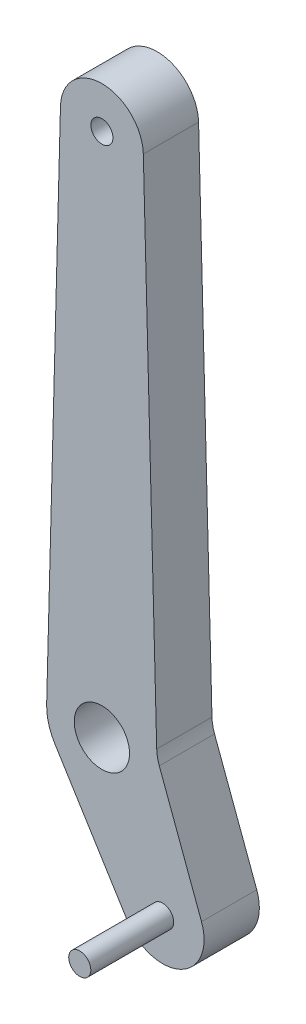
ISO-10303-21;
HEADER;
FILE_DESCRIPTION(('STEP AP214'),'2;1');
FILE_NAME('part.step','',(''),(''),'','','');
FILE_SCHEMA(('AUTOMOTIVE_DESIGN { 1 0 10303 214 1 1 1 1 }'));
ENDSEC;
DATA;
#1=APPLICATION_CONTEXT('core data for automotive mechanical design processes');
#2=APPLICATION_PROTOCOL_DEFINITION('international standard','automotive_design',2000,#1);
#3=PRODUCT_CONTEXT('',#1,'mechanical');
#4=PRODUCT('Part','Part','',(#3));
#5=PRODUCT_RELATED_PRODUCT_CATEGORY('part','',(#4));
#6=PRODUCT_DEFINITION_FORMATION('','',#4);
#7=PRODUCT_DEFINITION_CONTEXT('part definition',#1,'design');
#8=PRODUCT_DEFINITION('design','',#6,#7);
#9=PRODUCT_DEFINITION_SHAPE('','',#8);
#10=(LENGTH_UNIT() NAMED_UNIT(*) SI_UNIT(.MILLI.,.METRE.));
#11=(NAMED_UNIT(*) PLANE_ANGLE_UNIT() SI_UNIT($,.RADIAN.));
#12=(NAMED_UNIT(*) SI_UNIT($,.STERADIAN.) SOLID_ANGLE_UNIT());
#13=UNCERTAINTY_MEASURE_WITH_UNIT(LENGTH_MEASURE(1.E-05),#10,'distance_accuracy_value','');
#14=(GEOMETRIC_REPRESENTATION_CONTEXT(3) GLOBAL_UNCERTAINTY_ASSIGNED_CONTEXT((#13)) GLOBAL_UNIT_ASSIGNED_CONTEXT((#10,
#11,#12)) REPRESENTATION_CONTEXT('',''));
#15=CARTESIAN_POINT('',(0.,0.,0.));
#16=DIRECTION('',(0.,0.,1.));
#17=DIRECTION('',(1.,0.,0.));
#18=AXIS2_PLACEMENT_3D('',#15,#16,#17);
#19=CARTESIAN_POINT('',(34.8350454567526,6.72670788740218,20.));
#20=DIRECTION('',(0.,0.,-1.));
#21=DIRECTION('',(-1.,0.,0.));
#22=AXIS2_PLACEMENT_3D('',#19,#20,#21);
#23=PLANE('',#22);
#24=CARTESIAN_POINT('',(21.9891213888172,-44.9052172976355,20.));
#25=DIRECTION('',(0.,0.,-1.));
#26=DIRECTION('',(-1.,0.,0.));
#27=AXIS2_PLACEMENT_3D('',#24,#25,#26);
#28=CIRCLE('',#27,4.);
#29=CARTESIAN_POINT('',(17.9891213888172,-44.9052172976355,20.));
#30=VERTEX_POINT('',#29);
#31=EDGE_CURVE('E11',#30,#30,#28,.F.);
#32=ORIENTED_EDGE('',*,*,#31,.F.);
#33=EDGE_LOOP('',(#32));
#34=FACE_BOUND('',#33,.T.);
#35=CARTESIAN_POINT('',(34.8350454567526,6.72670788740218,20.));
#36=DIRECTION('',(0.,0.,-1.));
#37=DIRECTION('',(-1.,0.,0.));
#38=AXIS2_PLACEMENT_3D('',#35,#36,#37);
#39=CIRCLE('',#38,15.);
#40=CARTESIAN_POINT('',(20.771333693581,1.51019454586554,20.));
#41=VERTEX_POINT('',#40);
#42=CARTESIAN_POINT('',(19.8402402621032,6.33197104529698,20.));
#43=VERTEX_POINT('',#42);
#44=EDGE_CURVE('E171',#41,#43,#39,.T.);
#45=ORIENTED_EDGE('',*,*,#44,.T.);
#46=DIRECTION('',(-0.0263157894736839,0.999653679643294,0.));
#47=VECTOR('',#46,1.);
#48=CARTESIAN_POINT('',(14.9948051946494,190.394736842105,20.));
#49=LINE('',#48,#47);
#50=CARTESIAN_POINT('',(14.9948051946494,190.394736842105,20.));
#51=VERTEX_POINT('',#50);
#52=EDGE_CURVE('E107',#43,#51,#49,.T.);
#53=ORIENTED_EDGE('',*,*,#52,.T.);
#54=CARTESIAN_POINT('',(0.,190.,20.));
#55=DIRECTION('',(0.,0.,1.));
#56=DIRECTION('',(1.,0.,0.));
#57=AXIS2_PLACEMENT_3D('',#54,#55,#56);
#58=CIRCLE('',#57,15.);
#59=CARTESIAN_POINT('',(-14.9948051946494,190.394736842105,20.));
#60=VERTEX_POINT('',#59);
#61=EDGE_CURVE('E211',#51,#60,#58,.T.);
#62=ORIENTED_EDGE('',*,*,#61,.T.);
#63=DIRECTION('',(-0.0263157894736842,-0.999653679643294,0.));
#64=VECTOR('',#63,1.);
#65=CARTESIAN_POINT('',(-14.9948051946494,190.394736842105,20.));
#66=LINE('',#65,#64);
#67=CARTESIAN_POINT('',(-19.9930735928659,0.526315789473687,20.));
#68=VERTEX_POINT('',#67);
#69=EDGE_CURVE('E209',#60,#68,#66,.T.);
#70=ORIENTED_EDGE('',*,*,#69,.T.);
#71=CARTESIAN_POINT('',(0.,0.,20.));
#72=DIRECTION('',(0.,0.,1.));
#73=DIRECTION('',(1.,0.,0.));
#74=AXIS2_PLACEMENT_3D('',#71,#72,#73);
#75=CIRCLE('',#74,20.);
#76=CARTESIAN_POINT('',(-16.9924859731234,-10.5477685058597,20.));
#77=VERTEX_POINT('',#76);
#78=EDGE_CURVE('E126',#68,#77,#75,.T.);
#79=ORIENTED_EDGE('',*,*,#78,.T.);
#80=DIRECTION('',(0.527388425292983,-0.84962429865617,0.));
#81=VECTOR('',#80,1.);
#82=CARTESIAN_POINT('',(-16.9924859731234,-10.5477685058597,20.));
#83=LINE('',#82,#81);
#84=CARTESIAN_POINT('',(9.24475690897465,-52.8160436770302,20.));
#85=VERTEX_POINT('',#84);
#86=EDGE_CURVE('E120',#77,#85,#83,.T.);
#87=ORIENTED_EDGE('',*,*,#86,.T.);
#88=CARTESIAN_POINT('',(21.9891213888172,-44.9052172976355,20.));
#89=DIRECTION('',(0.,0.,1.));
#90=DIRECTION('',(1.,0.,0.));
#91=AXIS2_PLACEMENT_3D('',#88,#89,#90);
#92=CIRCLE('',#91,15.);
#93=CARTESIAN_POINT('',(36.0528331519888,-39.6887039560989,20.));
#94=VERTEX_POINT('',#93);
#95=EDGE_CURVE('E124',#85,#94,#92,.T.);
#96=ORIENTED_EDGE('',*,*,#95,.T.);
#97=DIRECTION('',(-0.34776755610244,0.937580784211439,0.));
#98=VECTOR('',#97,1.);
#99=CARTESIAN_POINT('',(36.0528331519888,-39.6887039560989,20.));
#100=LINE('',#99,#98);
#101=EDGE_CURVE('E63',#94,#41,#100,.T.);
#102=ORIENTED_EDGE('',*,*,#101,.T.);
#103=EDGE_LOOP('',(#45,#53,#62,#70,#79,#87,#96,#102));
#104=FACE_BOUND('',#103,.T.);
#105=CARTESIAN_POINT('',(0.,190.,20.));
#106=DIRECTION('',(0.,0.,1.));
#107=DIRECTION('',(1.,0.,0.));
#108=AXIS2_PLACEMENT_3D('',#105,#106,#107);
#109=CIRCLE('',#108,4.);
#110=CARTESIAN_POINT('',(4.,190.,20.));
#111=VERTEX_POINT('',#110);
#112=EDGE_CURVE('E153',#111,#111,#109,.T.);
#113=ORIENTED_EDGE('',*,*,#112,.F.);
#114=EDGE_LOOP('',(#113));
#115=FACE_BOUND('',#114,.T.);
#116=CARTESIAN_POINT('',(0.,0.,20.));
#117=DIRECTION('',(0.,0.,1.));
#118=DIRECTION('',(1.,0.,0.));
#119=AXIS2_PLACEMENT_3D('',#116,#117,#118);
#120=CIRCLE('',#119,10.);
#121=CARTESIAN_POINT('',(10.,0.,20.));
#122=VERTEX_POINT('',#121);
#123=EDGE_CURVE('E225',#122,#122,#120,.T.);
#124=ORIENTED_EDGE('',*,*,#123,.F.);
#125=EDGE_LOOP('',(#124));
#126=FACE_BOUND('',#125,.T.);
#127=ADVANCED_FACE('F45',(#34,#104,#115,#126),#23,.F.);
#128=CARTESIAN_POINT('',(34.8350454567526,6.72670788740218,0.));
#129=DIRECTION('',(0.,0.,-1.));
#130=DIRECTION('',(-1.,0.,0.));
#131=AXIS2_PLACEMENT_3D('',#128,#129,#130);
#132=PLANE('',#131);
#133=CARTESIAN_POINT('',(0.,190.,0.));
#134=DIRECTION('',(0.,0.,1.));
#135=DIRECTION('',(1.,0.,0.));
#136=AXIS2_PLACEMENT_3D('',#133,#134,#135);
#137=CIRCLE('',#136,4.);
#138=CARTESIAN_POINT('',(4.,190.,0.));
#139=VERTEX_POINT('',#138);
#140=EDGE_CURVE('E221',#139,#139,#137,.T.);
#141=ORIENTED_EDGE('',*,*,#140,.T.);
#142=EDGE_LOOP('',(#141));
#143=FACE_BOUND('',#142,.T.);
#144=CARTESIAN_POINT('',(34.8350454567526,6.72670788740218,0.));
#145=DIRECTION('',(0.,0.,-1.));
#146=DIRECTION('',(-1.,0.,0.));
#147=AXIS2_PLACEMENT_3D('',#144,#145,#146);
#148=CIRCLE('',#147,15.);
#149=CARTESIAN_POINT('',(20.771333693581,1.51019454586554,0.));
#150=VERTEX_POINT('',#149);
#151=CARTESIAN_POINT('',(19.8402402621032,6.33197104529698,0.));
#152=VERTEX_POINT('',#151);
#153=EDGE_CURVE('E148',#150,#152,#148,.T.);
#154=ORIENTED_EDGE('',*,*,#153,.F.);
#155=DIRECTION('',(-0.34776755610244,0.937580784211439,0.));
#156=VECTOR('',#155,1.);
#157=CARTESIAN_POINT('',(36.0528331519888,-39.6887039560989,0.));
#158=LINE('',#157,#156);
#159=CARTESIAN_POINT('',(36.0528331519888,-39.6887039560989,0.));
#160=VERTEX_POINT('',#159);
#161=EDGE_CURVE('E98',#160,#150,#158,.T.);
#162=ORIENTED_EDGE('',*,*,#161,.F.);
#163=CARTESIAN_POINT('',(21.9891213888172,-44.9052172976355,0.));
#164=DIRECTION('',(0.,0.,1.));
#165=DIRECTION('',(1.,0.,0.));
#166=AXIS2_PLACEMENT_3D('',#163,#164,#165);
#167=CIRCLE('',#166,15.);
#168=CARTESIAN_POINT('',(9.24475690897465,-52.8160436770302,0.));
#169=VERTEX_POINT('',#168);
#170=EDGE_CURVE('E92',#169,#160,#167,.T.);
#171=ORIENTED_EDGE('',*,*,#170,.F.);
#172=DIRECTION('',(0.527388425292983,-0.84962429865617,0.));
#173=VECTOR('',#172,1.);
#174=CARTESIAN_POINT('',(-16.9924859731234,-10.5477685058597,0.));
#175=LINE('',#174,#173);
#176=CARTESIAN_POINT('',(-16.9924859731234,-10.5477685058597,0.));
#177=VERTEX_POINT('',#176);
#178=EDGE_CURVE('E135',#177,#169,#175,.T.);
#179=ORIENTED_EDGE('',*,*,#178,.F.);
#180=CARTESIAN_POINT('',(0.,0.,0.));
#181=DIRECTION('',(0.,0.,1.));
#182=DIRECTION('',(1.,0.,0.));
#183=AXIS2_PLACEMENT_3D('',#180,#181,#182);
#184=CIRCLE('',#183,20.);
#185=CARTESIAN_POINT('',(-19.9930735928659,0.526315789473687,0.));
#186=VERTEX_POINT('',#185);
#187=EDGE_CURVE('E162',#186,#177,#184,.T.);
#188=ORIENTED_EDGE('',*,*,#187,.F.);
#189=DIRECTION('',(-0.0263157894736842,-0.999653679643294,0.));
#190=VECTOR('',#189,1.);
#191=CARTESIAN_POINT('',(-14.9948051946494,190.394736842105,0.));
#192=LINE('',#191,#190);
#193=CARTESIAN_POINT('',(-14.9948051946494,190.394736842105,0.));
#194=VERTEX_POINT('',#193);
#195=EDGE_CURVE('E159',#194,#186,#192,.T.);
#196=ORIENTED_EDGE('',*,*,#195,.F.);
#197=CARTESIAN_POINT('',(0.,190.,0.));
#198=DIRECTION('',(0.,0.,1.));
#199=DIRECTION('',(1.,0.,0.));
#200=AXIS2_PLACEMENT_3D('',#197,#198,#199);
#201=CIRCLE('',#200,15.);
#202=CARTESIAN_POINT('',(14.9948051946494,190.394736842105,0.));
#203=VERTEX_POINT('',#202);
#204=EDGE_CURVE('E156',#203,#194,#201,.T.);
#205=ORIENTED_EDGE('',*,*,#204,.F.);
#206=DIRECTION('',(-0.0263157894736839,0.999653679643294,0.));
#207=VECTOR('',#206,1.);
#208=CARTESIAN_POINT('',(14.9948051946494,190.394736842105,0.));
#209=LINE('',#208,#207);
#210=EDGE_CURVE('E152',#152,#203,#209,.T.);
#211=ORIENTED_EDGE('',*,*,#210,.F.);
#212=EDGE_LOOP('',(#154,#162,#171,#179,#188,#196,#205,#211));
#213=FACE_BOUND('',#212,.T.);
#214=CARTESIAN_POINT('',(0.,0.,0.));
#215=DIRECTION('',(0.,0.,1.));
#216=DIRECTION('',(1.,0.,0.));
#217=AXIS2_PLACEMENT_3D('',#214,#215,#216);
#218=CIRCLE('',#217,10.);
#219=CARTESIAN_POINT('',(10.,0.,0.));
#220=VERTEX_POINT('',#219);
#221=EDGE_CURVE('E229',#220,#220,#218,.T.);
#222=ORIENTED_EDGE('',*,*,#221,.T.);
#223=EDGE_LOOP('',(#222));
#224=FACE_BOUND('',#223,.T.);
#225=ADVANCED_FACE('F196',(#143,#213,#224),#132,.T.);
#226=CARTESIAN_POINT('',(34.8350454567526,6.72670788740218,20.));
#227=DIRECTION('',(0.,0.,-1.));
#228=DIRECTION('',(-1.,0.,0.));
#229=AXIS2_PLACEMENT_3D('',#226,#227,#228);
#230=CYLINDRICAL_SURFACE('',#229,15.);
#231=ORIENTED_EDGE('',*,*,#153,.T.);
#232=DIRECTION('',(0.,0.,-1.));
#233=VECTOR('',#232,1.);
#234=CARTESIAN_POINT('',(19.8402402621032,6.33197104529698,20.));
#235=LINE('',#234,#233);
#236=EDGE_CURVE('E55',#43,#152,#235,.T.);
#237=ORIENTED_EDGE('',*,*,#236,.F.);
#238=ORIENTED_EDGE('',*,*,#44,.F.);
#239=DIRECTION('',(0.,0.,-1.));
#240=VECTOR('',#239,1.);
#241=CARTESIAN_POINT('',(20.771333693581,1.51019454586554,20.));
#242=LINE('',#241,#240);
#243=EDGE_CURVE('E144',#41,#150,#242,.T.);
#244=ORIENTED_EDGE('',*,*,#243,.T.);
#245=EDGE_LOOP('',(#231,#237,#238,#244));
#246=FACE_BOUND('',#245,.T.);
#247=ADVANCED_FACE('F47',(#246),#230,.F.);
#248=CARTESIAN_POINT('',(14.9948051946494,190.394736842105,20.));
#249=DIRECTION('',(-0.999653679643294,-0.0263157894736839,0.));
#250=DIRECTION('',(0.0263157894736839,-0.999653679643294,0.));
#251=AXIS2_PLACEMENT_3D('',#248,#249,#250);
#252=PLANE('',#251);
#253=ORIENTED_EDGE('',*,*,#210,.T.);
#254=DIRECTION('',(0.,0.,-1.));
#255=VECTOR('',#254,1.);
#256=CARTESIAN_POINT('',(14.9948051946494,190.394736842105,20.));
#257=LINE('',#256,#255);
#258=EDGE_CURVE('E186',#51,#203,#257,.T.);
#259=ORIENTED_EDGE('',*,*,#258,.F.);
#260=ORIENTED_EDGE('',*,*,#52,.F.);
#261=ORIENTED_EDGE('',*,*,#236,.T.);
#262=EDGE_LOOP('',(#253,#259,#260,#261));
#263=FACE_BOUND('',#262,.T.);
#264=ADVANCED_FACE('F191',(#263),#252,.F.);
#265=CARTESIAN_POINT('',(0.,190.,20.));
#266=DIRECTION('',(0.,0.,-1.));
#267=DIRECTION('',(-1.,0.,0.));
#268=AXIS2_PLACEMENT_3D('',#265,#266,#267);
#269=CYLINDRICAL_SURFACE('',#268,15.);
#270=ORIENTED_EDGE('',*,*,#204,.T.);
#271=DIRECTION('',(0.,0.,-1.));
#272=VECTOR('',#271,1.);
#273=CARTESIAN_POINT('',(-14.9948051946494,190.394736842105,20.));
#274=LINE('',#273,#272);
#275=EDGE_CURVE('E182',#60,#194,#274,.T.);
#276=ORIENTED_EDGE('',*,*,#275,.F.);
#277=ORIENTED_EDGE('',*,*,#61,.F.);
#278=ORIENTED_EDGE('',*,*,#258,.T.);
#279=EDGE_LOOP('',(#270,#276,#277,#278));
#280=FACE_BOUND('',#279,.T.);
#281=ADVANCED_FACE('F203',(#280),#269,.T.);
#282=CARTESIAN_POINT('',(-14.9948051946494,190.394736842105,20.));
#283=DIRECTION('',(0.999653679643294,-0.0263157894736842,0.));
#284=DIRECTION('',(0.0263157894736842,0.999653679643294,0.));
#285=AXIS2_PLACEMENT_3D('',#282,#283,#284);
#286=PLANE('',#285);
#287=ORIENTED_EDGE('',*,*,#195,.T.);
#288=DIRECTION('',(0.,0.,-1.));
#289=VECTOR('',#288,1.);
#290=CARTESIAN_POINT('',(-19.9930735928659,0.526315789473687,20.));
#291=LINE('',#290,#289);
#292=EDGE_CURVE('E178',#68,#186,#291,.T.);
#293=ORIENTED_EDGE('',*,*,#292,.F.);
#294=ORIENTED_EDGE('',*,*,#69,.F.);
#295=ORIENTED_EDGE('',*,*,#275,.T.);
#296=EDGE_LOOP('',(#287,#293,#294,#295));
#297=FACE_BOUND('',#296,.T.);
#298=ADVANCED_FACE('F207',(#297),#286,.F.);
#299=CARTESIAN_POINT('',(0.,0.,20.));
#300=DIRECTION('',(0.,0.,-1.));
#301=DIRECTION('',(-1.,0.,0.));
#302=AXIS2_PLACEMENT_3D('',#299,#300,#301);
#303=CYLINDRICAL_SURFACE('',#302,20.);
#304=ORIENTED_EDGE('',*,*,#187,.T.);
#305=DIRECTION('',(0.,0.,-1.));
#306=VECTOR('',#305,1.);
#307=CARTESIAN_POINT('',(-16.9924859731234,-10.5477685058597,20.));
#308=LINE('',#307,#306);
#309=EDGE_CURVE('E137',#77,#177,#308,.T.);
#310=ORIENTED_EDGE('',*,*,#309,.F.);
#311=ORIENTED_EDGE('',*,*,#78,.F.);
#312=ORIENTED_EDGE('',*,*,#292,.T.);
#313=EDGE_LOOP('',(#304,#310,#311,#312));
#314=FACE_BOUND('',#313,.T.);
#315=ADVANCED_FACE('F269',(#314),#303,.T.);
#316=CARTESIAN_POINT('',(-16.9924859731234,-10.5477685058597,20.));
#317=DIRECTION('',(0.84962429865617,0.527388425292983,0.));
#318=DIRECTION('',(-0.527388425292983,0.84962429865617,0.));
#319=AXIS2_PLACEMENT_3D('',#316,#317,#318);
#320=PLANE('',#319);
#321=ORIENTED_EDGE('',*,*,#178,.T.);
#322=DIRECTION('',(0.,0.,-1.));
#323=VECTOR('',#322,1.);
#324=CARTESIAN_POINT('',(9.24475690897465,-52.8160436770302,20.));
#325=LINE('',#324,#323);
#326=EDGE_CURVE('E132',#85,#169,#325,.T.);
#327=ORIENTED_EDGE('',*,*,#326,.F.);
#328=ORIENTED_EDGE('',*,*,#86,.F.);
#329=ORIENTED_EDGE('',*,*,#309,.T.);
#330=EDGE_LOOP('',(#321,#327,#328,#329));
#331=FACE_BOUND('',#330,.T.);
#332=ADVANCED_FACE('F133',(#331),#320,.F.);
#333=CARTESIAN_POINT('',(21.9891213888172,-44.9052172976355,20.));
#334=DIRECTION('',(0.,0.,-1.));
#335=DIRECTION('',(-1.,0.,0.));
#336=AXIS2_PLACEMENT_3D('',#333,#334,#335);
#337=CYLINDRICAL_SURFACE('',#336,15.);
#338=ORIENTED_EDGE('',*,*,#170,.T.);
#339=DIRECTION('',(0.,0.,-1.));
#340=VECTOR('',#339,1.);
#341=CARTESIAN_POINT('',(36.0528331519888,-39.6887039560989,20.));
#342=LINE('',#341,#340);
#343=EDGE_CURVE('E138',#94,#160,#342,.T.);
#344=ORIENTED_EDGE('',*,*,#343,.F.);
#345=ORIENTED_EDGE('',*,*,#95,.F.);
#346=ORIENTED_EDGE('',*,*,#326,.T.);
#347=EDGE_LOOP('',(#338,#344,#345,#346));
#348=FACE_BOUND('',#347,.T.);
#349=ADVANCED_FACE('F140',(#348),#337,.T.);
#350=CARTESIAN_POINT('',(36.0528331519888,-39.6887039560989,20.));
#351=DIRECTION('',(-0.937580784211439,-0.34776755610244,0.));
#352=DIRECTION('',(0.34776755610244,-0.937580784211439,0.));
#353=AXIS2_PLACEMENT_3D('',#350,#351,#352);
#354=PLANE('',#353);
#355=ORIENTED_EDGE('',*,*,#161,.T.);
#356=ORIENTED_EDGE('',*,*,#243,.F.);
#357=ORIENTED_EDGE('',*,*,#101,.F.);
#358=ORIENTED_EDGE('',*,*,#343,.T.);
#359=EDGE_LOOP('',(#355,#356,#357,#358));
#360=FACE_BOUND('',#359,.T.);
#361=ADVANCED_FACE('F262',(#360),#354,.F.);
#362=CARTESIAN_POINT('',(0.,190.,20.));
#363=DIRECTION('',(0.,0.,-1.));
#364=DIRECTION('',(-1.,0.,0.));
#365=AXIS2_PLACEMENT_3D('',#362,#363,#364);
#366=CYLINDRICAL_SURFACE('',#365,4.);
#367=ORIENTED_EDGE('',*,*,#112,.T.);
#368=EDGE_LOOP('',(#367));
#369=FACE_BOUND('',#368,.T.);
#370=ORIENTED_EDGE('',*,*,#140,.F.);
#371=EDGE_LOOP('',(#370));
#372=FACE_BOUND('',#371,.T.);
#373=ADVANCED_FACE('F259',(#369,#372),#366,.F.);
#374=CARTESIAN_POINT('',(0.,0.,20.));
#375=DIRECTION('',(0.,0.,-1.));
#376=DIRECTION('',(-1.,0.,0.));
#377=AXIS2_PLACEMENT_3D('',#374,#375,#376);
#378=CYLINDRICAL_SURFACE('',#377,10.);
#379=ORIENTED_EDGE('',*,*,#123,.T.);
#380=EDGE_LOOP('',(#379));
#381=FACE_BOUND('',#380,.T.);
#382=ORIENTED_EDGE('',*,*,#221,.F.);
#383=EDGE_LOOP('',(#382));
#384=FACE_BOUND('',#383,.T.);
#385=ADVANCED_FACE('F246',(#381,#384),#378,.F.);
#386=CARTESIAN_POINT('',(21.9891213888172,-44.9052172976355,50.));
#387=DIRECTION('',(0.,0.,-1.));
#388=DIRECTION('',(-1.,0.,0.));
#389=AXIS2_PLACEMENT_3D('',#386,#387,#388);
#390=CYLINDRICAL_SURFACE('',#389,4.);
#391=CARTESIAN_POINT('',(21.9891213888172,-44.9052172976355,50.));
#392=DIRECTION('',(0.,0.,1.));
#393=DIRECTION('',(1.,0.,0.));
#394=AXIS2_PLACEMENT_3D('',#391,#392,#393);
#395=CIRCLE('',#394,4.);
#396=CARTESIAN_POINT('',(25.9891213888172,-44.9052172976355,50.));
#397=VERTEX_POINT('',#396);
#398=EDGE_CURVE('E233',#397,#397,#395,.T.);
#399=ORIENTED_EDGE('',*,*,#398,.F.);
#400=EDGE_LOOP('',(#399));
#401=FACE_BOUND('',#400,.T.);
#402=ORIENTED_EDGE('',*,*,#31,.T.);
#403=EDGE_LOOP('',(#402));
#404=FACE_BOUND('',#403,.T.);
#405=ADVANCED_FACE('F243',(#401,#404),#390,.T.);
#406=CARTESIAN_POINT('',(21.9891213888172,-44.9052172976355,50.));
#407=DIRECTION('',(0.,0.,1.));
#408=DIRECTION('',(1.,0.,0.));
#409=AXIS2_PLACEMENT_3D('',#406,#407,#408);
#410=PLANE('',#409);
#411=ORIENTED_EDGE('',*,*,#398,.T.);
#412=EDGE_LOOP('',(#411));
#413=FACE_BOUND('',#412,.T.);
#414=ADVANCED_FACE('F241',(#413),#410,.T.);
#415=CLOSED_SHELL('',(#127,#225,#247,#264,#281,#298,#315,#332,#349,#361,#373,#385,#405,#414));
#416=MANIFOLD_SOLID_BREP('B2',#415);
#417=ADVANCED_BREP_SHAPE_REPRESENTATION('',(#18,#416),#14);
#418=SHAPE_DEFINITION_REPRESENTATION(#9,#417);
ENDSEC;
END-ISO-10303-21;
